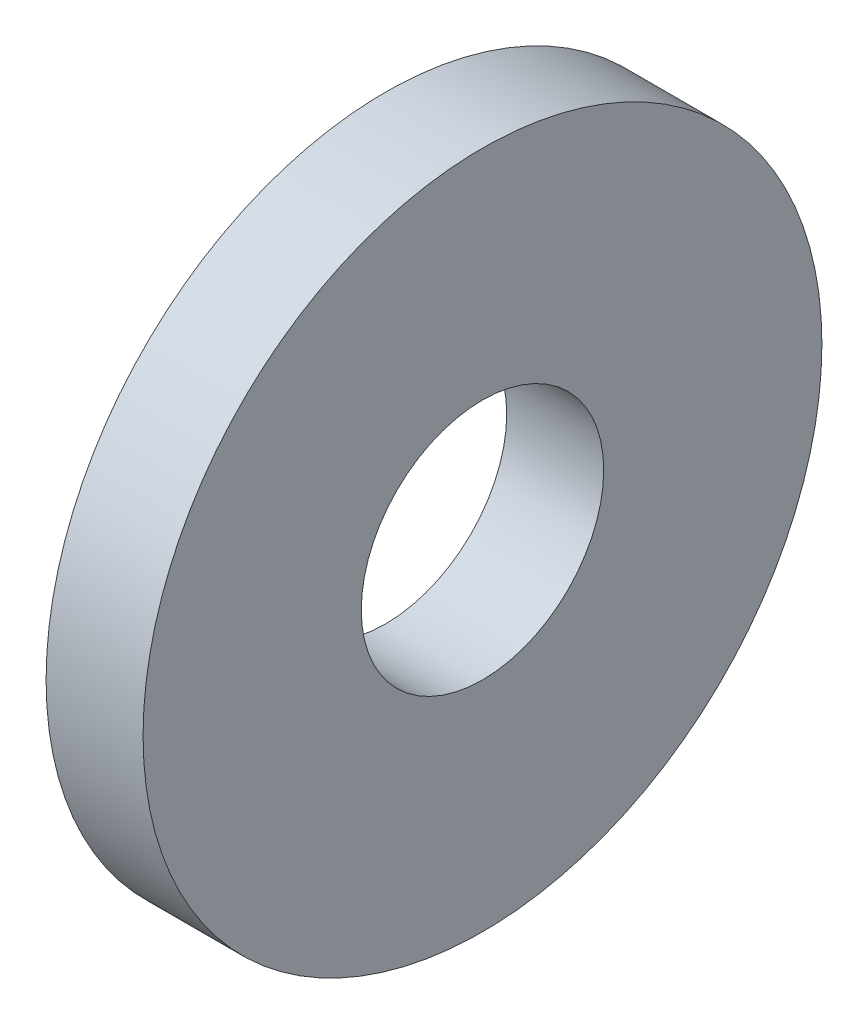
ISO-10303-21;
HEADER;
FILE_DESCRIPTION(('STEP AP214'),'2;1');
FILE_NAME('part.step','',(''),(''),'','','');
FILE_SCHEMA(('AUTOMOTIVE_DESIGN { 1 0 10303 214 1 1 1 1 }'));
ENDSEC;
DATA;
#1=APPLICATION_CONTEXT('core data for automotive mechanical design processes');
#2=APPLICATION_PROTOCOL_DEFINITION('international standard','automotive_design',2000,#1);
#3=PRODUCT_CONTEXT('',#1,'mechanical');
#4=PRODUCT('Part','Part','',(#3));
#5=PRODUCT_RELATED_PRODUCT_CATEGORY('part','',(#4));
#6=PRODUCT_DEFINITION_FORMATION('','',#4);
#7=PRODUCT_DEFINITION_CONTEXT('part definition',#1,'design');
#8=PRODUCT_DEFINITION('design','',#6,#7);
#9=PRODUCT_DEFINITION_SHAPE('','',#8);
#10=(LENGTH_UNIT() NAMED_UNIT(*) SI_UNIT(.MILLI.,.METRE.));
#11=(NAMED_UNIT(*) PLANE_ANGLE_UNIT() SI_UNIT($,.RADIAN.));
#12=(NAMED_UNIT(*) SI_UNIT($,.STERADIAN.) SOLID_ANGLE_UNIT());
#13=UNCERTAINTY_MEASURE_WITH_UNIT(LENGTH_MEASURE(1.E-05),#10,'distance_accuracy_value','');
#14=(GEOMETRIC_REPRESENTATION_CONTEXT(3) GLOBAL_UNCERTAINTY_ASSIGNED_CONTEXT((#13)) GLOBAL_UNIT_ASSIGNED_CONTEXT((#10,
#11,#12)) REPRESENTATION_CONTEXT('',''));
#15=CARTESIAN_POINT('',(0.,0.,0.));
#16=DIRECTION('',(0.,0.,1.));
#17=DIRECTION('',(1.,0.,0.));
#18=AXIS2_PLACEMENT_3D('',#15,#16,#17);
#19=CARTESIAN_POINT('',(1.,0.,0.));
#20=DIRECTION('',(1.,0.,0.));
#21=DIRECTION('',(0.,0.,-1.));
#22=AXIS2_PLACEMENT_3D('',#19,#20,#21);
#23=PLANE('',#22);
#24=CARTESIAN_POINT('',(1.,0.,0.));
#25=DIRECTION('',(1.,0.,0.));
#26=DIRECTION('',(0.,0.,-1.));
#27=AXIS2_PLACEMENT_3D('',#24,#25,#26);
#28=CIRCLE('',#27,3.5);
#29=CARTESIAN_POINT('',(1.,0.,-3.5));
#30=VERTEX_POINT('',#29);
#31=EDGE_CURVE('E10',#30,#30,#28,.T.);
#32=ORIENTED_EDGE('',*,*,#31,.T.);
#33=EDGE_LOOP('',(#32));
#34=FACE_BOUND('',#33,.T.);
#35=CARTESIAN_POINT('',(1.,0.,0.));
#36=DIRECTION('',(1.,0.,0.));
#37=DIRECTION('',(0.,0.,-1.));
#38=AXIS2_PLACEMENT_3D('',#35,#36,#37);
#39=CIRCLE('',#38,1.25);
#40=CARTESIAN_POINT('',(1.,0.,-1.25));
#41=VERTEX_POINT('',#40);
#42=EDGE_CURVE('E42',#41,#41,#39,.T.);
#43=ORIENTED_EDGE('',*,*,#42,.F.);
#44=EDGE_LOOP('',(#43));
#45=FACE_BOUND('',#44,.T.);
#46=ADVANCED_FACE('F31',(#34,#45),#23,.T.);
#47=CARTESIAN_POINT('',(0.,0.,0.));
#48=DIRECTION('',(1.,0.,0.));
#49=DIRECTION('',(0.,0.,-1.));
#50=AXIS2_PLACEMENT_3D('',#47,#48,#49);
#51=PLANE('',#50);
#52=CARTESIAN_POINT('',(0.,0.,0.));
#53=DIRECTION('',(1.,0.,0.));
#54=DIRECTION('',(0.,0.,-1.));
#55=AXIS2_PLACEMENT_3D('',#52,#53,#54);
#56=CIRCLE('',#55,3.5);
#57=CARTESIAN_POINT('',(0.,0.,-3.5));
#58=VERTEX_POINT('',#57);
#59=EDGE_CURVE('E35',#58,#58,#56,.T.);
#60=ORIENTED_EDGE('',*,*,#59,.F.);
#61=EDGE_LOOP('',(#60));
#62=FACE_BOUND('',#61,.T.);
#63=CARTESIAN_POINT('',(0.,0.,0.));
#64=DIRECTION('',(1.,0.,0.));
#65=DIRECTION('',(0.,0.,-1.));
#66=AXIS2_PLACEMENT_3D('',#63,#64,#65);
#67=CIRCLE('',#66,1.25);
#68=CARTESIAN_POINT('',(0.,0.,-1.25));
#69=VERTEX_POINT('',#68);
#70=EDGE_CURVE('E44',#69,#69,#67,.T.);
#71=ORIENTED_EDGE('',*,*,#70,.T.);
#72=EDGE_LOOP('',(#71));
#73=FACE_BOUND('',#72,.T.);
#74=ADVANCED_FACE('F54',(#62,#73),#51,.F.);
#75=CARTESIAN_POINT('',(1.,0.,0.));
#76=DIRECTION('',(-1.,0.,0.));
#77=DIRECTION('',(0.,0.,1.));
#78=AXIS2_PLACEMENT_3D('',#75,#76,#77);
#79=CYLINDRICAL_SURFACE('',#78,3.5);
#80=ORIENTED_EDGE('',*,*,#31,.F.);
#81=EDGE_LOOP('',(#80));
#82=FACE_BOUND('',#81,.T.);
#83=ORIENTED_EDGE('',*,*,#59,.T.);
#84=EDGE_LOOP('',(#83));
#85=FACE_BOUND('',#84,.T.);
#86=ADVANCED_FACE('F33',(#82,#85),#79,.T.);
#87=CARTESIAN_POINT('',(1.,0.,0.));
#88=DIRECTION('',(-1.,0.,0.));
#89=DIRECTION('',(0.,0.,1.));
#90=AXIS2_PLACEMENT_3D('',#87,#88,#89);
#91=CYLINDRICAL_SURFACE('',#90,1.25);
#92=ORIENTED_EDGE('',*,*,#42,.T.);
#93=EDGE_LOOP('',(#92));
#94=FACE_BOUND('',#93,.T.);
#95=ORIENTED_EDGE('',*,*,#70,.F.);
#96=EDGE_LOOP('',(#95));
#97=FACE_BOUND('',#96,.T.);
#98=ADVANCED_FACE('F50',(#94,#97),#91,.F.);
#99=CLOSED_SHELL('',(#46,#74,#86,#98));
#100=MANIFOLD_SOLID_BREP('B2',#99);
#101=ADVANCED_BREP_SHAPE_REPRESENTATION('',(#18,#100),#14);
#102=SHAPE_DEFINITION_REPRESENTATION(#9,#101);
ENDSEC;
END-ISO-10303-21;
